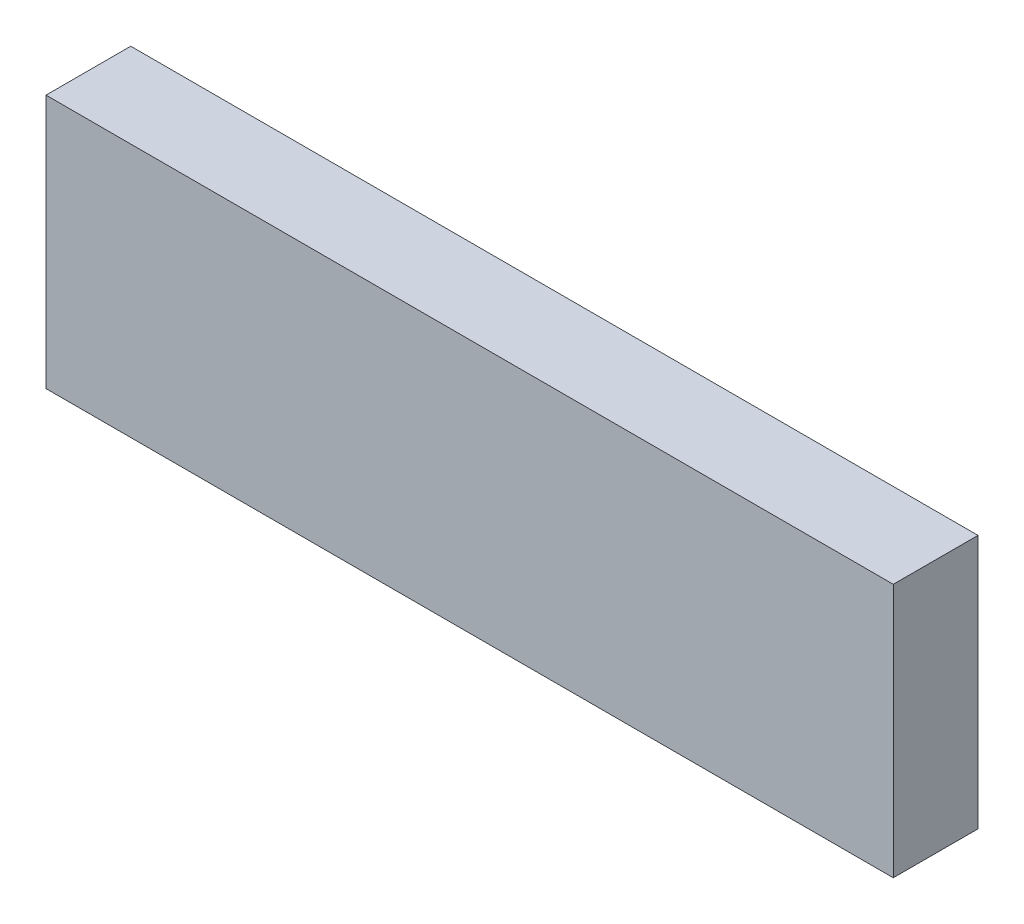
ISO-10303-21;
HEADER;
FILE_DESCRIPTION(('STEP AP214'),'2;1');
FILE_NAME('part.step','',(''),(''),'','','');
FILE_SCHEMA(('AUTOMOTIVE_DESIGN { 1 0 10303 214 1 1 1 1 }'));
ENDSEC;
DATA;
#1=APPLICATION_CONTEXT('core data for automotive mechanical design processes');
#2=APPLICATION_PROTOCOL_DEFINITION('international standard','automotive_design',2000,#1);
#3=PRODUCT_CONTEXT('',#1,'mechanical');
#4=PRODUCT('Part','Part','',(#3));
#5=PRODUCT_RELATED_PRODUCT_CATEGORY('part','',(#4));
#6=PRODUCT_DEFINITION_FORMATION('','',#4);
#7=PRODUCT_DEFINITION_CONTEXT('part definition',#1,'design');
#8=PRODUCT_DEFINITION('design','',#6,#7);
#9=PRODUCT_DEFINITION_SHAPE('','',#8);
#10=(LENGTH_UNIT() NAMED_UNIT(*) SI_UNIT(.MILLI.,.METRE.));
#11=(NAMED_UNIT(*) PLANE_ANGLE_UNIT() SI_UNIT($,.RADIAN.));
#12=(NAMED_UNIT(*) SI_UNIT($,.STERADIAN.) SOLID_ANGLE_UNIT());
#13=UNCERTAINTY_MEASURE_WITH_UNIT(LENGTH_MEASURE(1.E-05),#10,'distance_accuracy_value','');
#14=(GEOMETRIC_REPRESENTATION_CONTEXT(3) GLOBAL_UNCERTAINTY_ASSIGNED_CONTEXT((#13)) GLOBAL_UNIT_ASSIGNED_CONTEXT((#10,
#11,#12)) REPRESENTATION_CONTEXT('',''));
#15=CARTESIAN_POINT('',(0.,0.,0.));
#16=DIRECTION('',(0.,0.,1.));
#17=DIRECTION('',(1.,0.,0.));
#18=AXIS2_PLACEMENT_3D('',#15,#16,#17);
#19=CARTESIAN_POINT('',(250.,75.0000000000001,25.));
#20=DIRECTION('',(-1.,0.,0.));
#21=DIRECTION('',(0.,-1.,0.));
#22=AXIS2_PLACEMENT_3D('',#19,#20,#21);
#23=PLANE('',#22);
#24=DIRECTION('',(0.,1.,0.));
#25=VECTOR('',#24,1.);
#26=CARTESIAN_POINT('',(250.,75.0000000000001,-25.));
#27=LINE('',#26,#25);
#28=CARTESIAN_POINT('',(250.,-75.,-25.));
#29=VERTEX_POINT('',#28);
#30=CARTESIAN_POINT('',(250.,75.0000000000001,-25.));
#31=VERTEX_POINT('',#30);
#32=EDGE_CURVE('E114',#29,#31,#27,.T.);
#33=ORIENTED_EDGE('',*,*,#32,.T.);
#34=DIRECTION('',(0.,0.,-1.));
#35=VECTOR('',#34,1.);
#36=CARTESIAN_POINT('',(250.,75.0000000000001,25.));
#37=LINE('',#36,#35);
#38=CARTESIAN_POINT('',(250.,75.0000000000001,25.));
#39=VERTEX_POINT('',#38);
#40=EDGE_CURVE('E11',#39,#31,#37,.T.);
#41=ORIENTED_EDGE('',*,*,#40,.F.);
#42=DIRECTION('',(0.,1.,0.));
#43=VECTOR('',#42,1.);
#44=CARTESIAN_POINT('',(250.,75.0000000000001,25.));
#45=LINE('',#44,#43);
#46=CARTESIAN_POINT('',(250.,-75.,25.));
#47=VERTEX_POINT('',#46);
#48=EDGE_CURVE('E100',#47,#39,#45,.T.);
#49=ORIENTED_EDGE('',*,*,#48,.F.);
#50=DIRECTION('',(0.,0.,-1.));
#51=VECTOR('',#50,1.);
#52=CARTESIAN_POINT('',(250.,-75.,25.));
#53=LINE('',#52,#51);
#54=EDGE_CURVE('E108',#47,#29,#53,.T.);
#55=ORIENTED_EDGE('',*,*,#54,.T.);
#56=EDGE_LOOP('',(#33,#41,#49,#55));
#57=FACE_BOUND('',#56,.T.);
#58=ADVANCED_FACE('F44',(#57),#23,.F.);
#59=CARTESIAN_POINT('',(-250.,75.0000000000001,25.));
#60=DIRECTION('',(0.,-1.,0.));
#61=DIRECTION('',(0.,0.,-1.));
#62=AXIS2_PLACEMENT_3D('',#59,#60,#61);
#63=PLANE('',#62);
#64=DIRECTION('',(-1.,0.,0.));
#65=VECTOR('',#64,1.);
#66=CARTESIAN_POINT('',(-250.,75.0000000000001,-25.));
#67=LINE('',#66,#65);
#68=CARTESIAN_POINT('',(-250.,75.0000000000001,-25.));
#69=VERTEX_POINT('',#68);
#70=EDGE_CURVE('E105',#31,#69,#67,.T.);
#71=ORIENTED_EDGE('',*,*,#70,.T.);
#72=DIRECTION('',(0.,0.,-1.));
#73=VECTOR('',#72,1.);
#74=CARTESIAN_POINT('',(-250.,75.0000000000001,25.));
#75=LINE('',#74,#73);
#76=CARTESIAN_POINT('',(-250.,75.0000000000001,25.));
#77=VERTEX_POINT('',#76);
#78=EDGE_CURVE('E53',#77,#69,#75,.T.);
#79=ORIENTED_EDGE('',*,*,#78,.F.);
#80=DIRECTION('',(-1.,0.,0.));
#81=VECTOR('',#80,1.);
#82=CARTESIAN_POINT('',(-250.,75.0000000000001,25.));
#83=LINE('',#82,#81);
#84=EDGE_CURVE('E95',#39,#77,#83,.T.);
#85=ORIENTED_EDGE('',*,*,#84,.F.);
#86=ORIENTED_EDGE('',*,*,#40,.T.);
#87=EDGE_LOOP('',(#71,#79,#85,#86));
#88=FACE_BOUND('',#87,.T.);
#89=ADVANCED_FACE('F101',(#88),#63,.F.);
#90=CARTESIAN_POINT('',(-250.,75.0000000000001,25.));
#91=DIRECTION('',(1.,0.,0.));
#92=DIRECTION('',(0.,0.,-1.));
#93=AXIS2_PLACEMENT_3D('',#90,#91,#92);
#94=PLANE('',#93);
#95=DIRECTION('',(0.,-1.,0.));
#96=VECTOR('',#95,1.);
#97=CARTESIAN_POINT('',(-250.,75.0000000000001,-25.));
#98=LINE('',#97,#96);
#99=CARTESIAN_POINT('',(-250.,-75.,-25.));
#100=VERTEX_POINT('',#99);
#101=EDGE_CURVE('E76',#69,#100,#98,.T.);
#102=ORIENTED_EDGE('',*,*,#101,.T.);
#103=DIRECTION('',(0.,0.,-1.));
#104=VECTOR('',#103,1.);
#105=CARTESIAN_POINT('',(-250.,-75.,25.));
#106=LINE('',#105,#104);
#107=CARTESIAN_POINT('',(-250.,-75.,25.));
#108=VERTEX_POINT('',#107);
#109=EDGE_CURVE('E102',#108,#100,#106,.T.);
#110=ORIENTED_EDGE('',*,*,#109,.F.);
#111=DIRECTION('',(0.,-1.,0.));
#112=VECTOR('',#111,1.);
#113=CARTESIAN_POINT('',(-250.,75.0000000000001,25.));
#114=LINE('',#113,#112);
#115=EDGE_CURVE('E92',#77,#108,#114,.T.);
#116=ORIENTED_EDGE('',*,*,#115,.F.);
#117=ORIENTED_EDGE('',*,*,#78,.T.);
#118=EDGE_LOOP('',(#102,#110,#116,#117));
#119=FACE_BOUND('',#118,.T.);
#120=ADVANCED_FACE('F104',(#119),#94,.F.);
#121=CARTESIAN_POINT('',(-250.,-75.,25.));
#122=DIRECTION('',(0.,1.,0.));
#123=DIRECTION('',(0.,0.,1.));
#124=AXIS2_PLACEMENT_3D('',#121,#122,#123);
#125=PLANE('',#124);
#126=DIRECTION('',(1.,0.,0.));
#127=VECTOR('',#126,1.);
#128=CARTESIAN_POINT('',(-250.,-75.,-25.));
#129=LINE('',#128,#127);
#130=EDGE_CURVE('E84',#100,#29,#129,.T.);
#131=ORIENTED_EDGE('',*,*,#130,.T.);
#132=ORIENTED_EDGE('',*,*,#54,.F.);
#133=DIRECTION('',(1.,0.,0.));
#134=VECTOR('',#133,1.);
#135=CARTESIAN_POINT('',(-250.,-75.,25.));
#136=LINE('',#135,#134);
#137=EDGE_CURVE('E65',#108,#47,#136,.T.);
#138=ORIENTED_EDGE('',*,*,#137,.F.);
#139=ORIENTED_EDGE('',*,*,#109,.T.);
#140=EDGE_LOOP('',(#131,#132,#138,#139));
#141=FACE_BOUND('',#140,.T.);
#142=ADVANCED_FACE('F127',(#141),#125,.F.);
#143=CARTESIAN_POINT('',(0.,0.,25.));
#144=DIRECTION('',(0.,0.,1.));
#145=DIRECTION('',(1.,0.,0.));
#146=AXIS2_PLACEMENT_3D('',#143,#144,#145);
#147=PLANE('',#146);
#148=ORIENTED_EDGE('',*,*,#48,.T.);
#149=ORIENTED_EDGE('',*,*,#84,.T.);
#150=ORIENTED_EDGE('',*,*,#115,.T.);
#151=ORIENTED_EDGE('',*,*,#137,.T.);
#152=EDGE_LOOP('',(#148,#149,#150,#151));
#153=FACE_BOUND('',#152,.T.);
#154=ADVANCED_FACE('F91',(#153),#147,.T.);
#155=CARTESIAN_POINT('',(0.,0.,-25.));
#156=DIRECTION('',(0.,0.,1.));
#157=DIRECTION('',(1.,0.,0.));
#158=AXIS2_PLACEMENT_3D('',#155,#156,#157);
#159=PLANE('',#158);
#160=ORIENTED_EDGE('',*,*,#32,.F.);
#161=ORIENTED_EDGE('',*,*,#130,.F.);
#162=ORIENTED_EDGE('',*,*,#101,.F.);
#163=ORIENTED_EDGE('',*,*,#70,.F.);
#164=EDGE_LOOP('',(#160,#161,#162,#163));
#165=FACE_BOUND('',#164,.T.);
#166=ADVANCED_FACE('F129',(#165),#159,.F.);
#167=CLOSED_SHELL('',(#58,#89,#120,#142,#154,#166));
#168=MANIFOLD_SOLID_BREP('B2',#167);
#169=ADVANCED_BREP_SHAPE_REPRESENTATION('',(#18,#168),#14);
#170=SHAPE_DEFINITION_REPRESENTATION(#9,#169);
ENDSEC;
END-ISO-10303-21;
